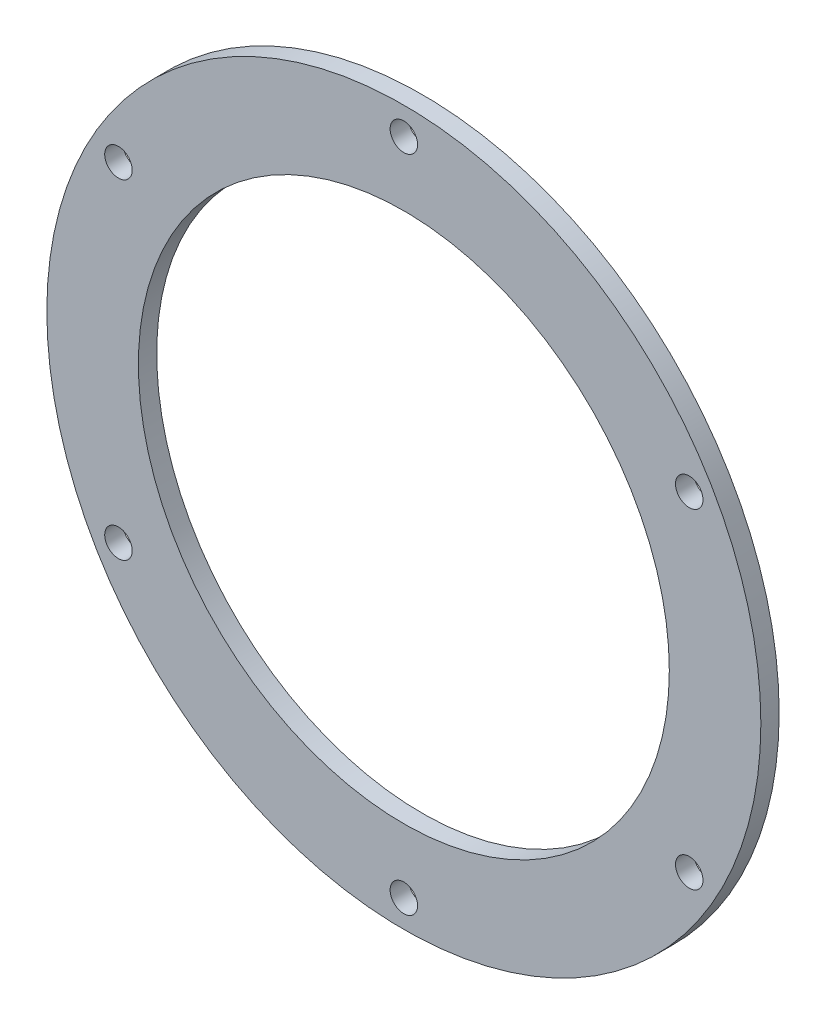
ISO-10303-21;
HEADER;
FILE_DESCRIPTION(('STEP AP214'),'2;1');
FILE_NAME('part.step','',(''),(''),'','','');
FILE_SCHEMA(('AUTOMOTIVE_DESIGN { 1 0 10303 214 1 1 1 1 }'));
ENDSEC;
DATA;
#1=APPLICATION_CONTEXT('core data for automotive mechanical design processes');
#2=APPLICATION_PROTOCOL_DEFINITION('international standard','automotive_design',2000,#1);
#3=PRODUCT_CONTEXT('',#1,'mechanical');
#4=PRODUCT('Part','Part','',(#3));
#5=PRODUCT_RELATED_PRODUCT_CATEGORY('part','',(#4));
#6=PRODUCT_DEFINITION_FORMATION('','',#4);
#7=PRODUCT_DEFINITION_CONTEXT('part definition',#1,'design');
#8=PRODUCT_DEFINITION('design','',#6,#7);
#9=PRODUCT_DEFINITION_SHAPE('','',#8);
#10=(LENGTH_UNIT() NAMED_UNIT(*) SI_UNIT(.MILLI.,.METRE.));
#11=(NAMED_UNIT(*) PLANE_ANGLE_UNIT() SI_UNIT($,.RADIAN.));
#12=(NAMED_UNIT(*) SI_UNIT($,.STERADIAN.) SOLID_ANGLE_UNIT());
#13=UNCERTAINTY_MEASURE_WITH_UNIT(LENGTH_MEASURE(1.E-05),#10,'distance_accuracy_value','');
#14=(GEOMETRIC_REPRESENTATION_CONTEXT(3) GLOBAL_UNCERTAINTY_ASSIGNED_CONTEXT((#13)) GLOBAL_UNIT_ASSIGNED_CONTEXT((#10,
#11,#12)) REPRESENTATION_CONTEXT('',''));
#15=CARTESIAN_POINT('',(0.,0.,0.));
#16=DIRECTION('',(0.,0.,1.));
#17=DIRECTION('',(1.,0.,0.));
#18=AXIS2_PLACEMENT_3D('',#15,#16,#17);
#19=CARTESIAN_POINT('',(0.,0.,2.));
#20=DIRECTION('',(0.,0.,-1.));
#21=DIRECTION('',(-1.,0.,0.));
#22=AXIS2_PLACEMENT_3D('',#19,#20,#21);
#23=CYLINDRICAL_SURFACE('',#22,29.);
#24=CARTESIAN_POINT('',(0.,0.,2.));
#25=DIRECTION('',(0.,0.,1.));
#26=DIRECTION('',(1.,0.,0.));
#27=AXIS2_PLACEMENT_3D('',#24,#25,#26);
#28=CIRCLE('',#27,29.);
#29=CARTESIAN_POINT('',(29.,0.,2.));
#30=VERTEX_POINT('',#29);
#31=EDGE_CURVE('E47',#30,#30,#28,.T.);
#32=ORIENTED_EDGE('',*,*,#31,.T.);
#33=EDGE_LOOP('',(#32));
#34=FACE_BOUND('',#33,.T.);
#35=CARTESIAN_POINT('',(0.,0.,0.));
#36=DIRECTION('',(0.,0.,1.));
#37=DIRECTION('',(1.,0.,0.));
#38=AXIS2_PLACEMENT_3D('',#35,#36,#37);
#39=CIRCLE('',#38,29.);
#40=CARTESIAN_POINT('',(29.,0.,0.));
#41=VERTEX_POINT('',#40);
#42=EDGE_CURVE('E73',#41,#41,#39,.T.);
#43=ORIENTED_EDGE('',*,*,#42,.F.);
#44=EDGE_LOOP('',(#43));
#45=FACE_BOUND('',#44,.T.);
#46=ADVANCED_FACE('F39',(#34,#45),#23,.F.);
#47=CARTESIAN_POINT('',(0.,36.,2.));
#48=DIRECTION('',(0.,0.,-1.));
#49=DIRECTION('',(-1.,0.,0.));
#50=AXIS2_PLACEMENT_3D('',#47,#48,#49);
#51=CYLINDRICAL_SURFACE('',#50,1.5);
#52=CARTESIAN_POINT('',(0.,36.,2.));
#53=DIRECTION('',(0.,0.,1.));
#54=DIRECTION('',(1.,0.,0.));
#55=AXIS2_PLACEMENT_3D('',#52,#53,#54);
#56=CIRCLE('',#55,1.5);
#57=CARTESIAN_POINT('',(1.5,36.,2.));
#58=VERTEX_POINT('',#57);
#59=EDGE_CURVE('E52',#58,#58,#56,.T.);
#60=ORIENTED_EDGE('',*,*,#59,.T.);
#61=EDGE_LOOP('',(#60));
#62=FACE_BOUND('',#61,.T.);
#63=CARTESIAN_POINT('',(0.,36.,0.));
#64=DIRECTION('',(0.,0.,1.));
#65=DIRECTION('',(1.,0.,0.));
#66=AXIS2_PLACEMENT_3D('',#63,#64,#65);
#67=CIRCLE('',#66,1.5);
#68=CARTESIAN_POINT('',(1.5,36.,0.));
#69=VERTEX_POINT('',#68);
#70=EDGE_CURVE('E71',#69,#69,#67,.T.);
#71=ORIENTED_EDGE('',*,*,#70,.F.);
#72=EDGE_LOOP('',(#71));
#73=FACE_BOUND('',#72,.T.);
#74=ADVANCED_FACE('F100',(#62,#73),#51,.F.);
#75=CARTESIAN_POINT('',(31.1769145362398,17.9999999999999,2.));
#76=DIRECTION('',(0.,0.,-1.));
#77=DIRECTION('',(-1.,0.,0.));
#78=AXIS2_PLACEMENT_3D('',#75,#76,#77);
#79=CYLINDRICAL_SURFACE('',#78,1.5);
#80=CARTESIAN_POINT('',(31.1769145362398,17.9999999999999,2.));
#81=DIRECTION('',(0.,0.,1.));
#82=DIRECTION('',(1.,0.,0.));
#83=AXIS2_PLACEMENT_3D('',#80,#81,#82);
#84=CIRCLE('',#83,1.5);
#85=CARTESIAN_POINT('',(32.6769145362398,17.9999999999999,2.));
#86=VERTEX_POINT('',#85);
#87=EDGE_CURVE('E95',#86,#86,#84,.T.);
#88=ORIENTED_EDGE('',*,*,#87,.T.);
#89=EDGE_LOOP('',(#88));
#90=FACE_BOUND('',#89,.T.);
#91=CARTESIAN_POINT('',(31.1769145362398,17.9999999999999,0.));
#92=DIRECTION('',(0.,0.,1.));
#93=DIRECTION('',(1.,0.,0.));
#94=AXIS2_PLACEMENT_3D('',#91,#92,#93);
#95=CIRCLE('',#94,1.5);
#96=CARTESIAN_POINT('',(32.6769145362398,17.9999999999999,0.));
#97=VERTEX_POINT('',#96);
#98=EDGE_CURVE('E68',#97,#97,#95,.T.);
#99=ORIENTED_EDGE('',*,*,#98,.F.);
#100=EDGE_LOOP('',(#99));
#101=FACE_BOUND('',#100,.T.);
#102=ADVANCED_FACE('F118',(#90,#101),#79,.F.);
#103=CARTESIAN_POINT('',(31.1769145362397,-18.0000000000001,2.));
#104=DIRECTION('',(0.,0.,-1.));
#105=DIRECTION('',(-1.,0.,0.));
#106=AXIS2_PLACEMENT_3D('',#103,#104,#105);
#107=CYLINDRICAL_SURFACE('',#106,1.5);
#108=CARTESIAN_POINT('',(31.1769145362397,-18.0000000000001,2.));
#109=DIRECTION('',(0.,0.,1.));
#110=DIRECTION('',(1.,0.,0.));
#111=AXIS2_PLACEMENT_3D('',#108,#109,#110);
#112=CIRCLE('',#111,1.5);
#113=CARTESIAN_POINT('',(32.6769145362397,-18.0000000000001,2.));
#114=VERTEX_POINT('',#113);
#115=EDGE_CURVE('E92',#114,#114,#112,.T.);
#116=ORIENTED_EDGE('',*,*,#115,.T.);
#117=EDGE_LOOP('',(#116));
#118=FACE_BOUND('',#117,.T.);
#119=CARTESIAN_POINT('',(31.1769145362397,-18.0000000000001,0.));
#120=DIRECTION('',(0.,0.,1.));
#121=DIRECTION('',(1.,0.,0.));
#122=AXIS2_PLACEMENT_3D('',#119,#120,#121);
#123=CIRCLE('',#122,1.5);
#124=CARTESIAN_POINT('',(32.6769145362397,-18.0000000000001,0.));
#125=VERTEX_POINT('',#124);
#126=EDGE_CURVE('E65',#125,#125,#123,.T.);
#127=ORIENTED_EDGE('',*,*,#126,.F.);
#128=EDGE_LOOP('',(#127));
#129=FACE_BOUND('',#128,.T.);
#130=ADVANCED_FACE('F125',(#118,#129),#107,.F.);
#131=CARTESIAN_POINT('',(-2.51386656396706E-13,-36.,2.));
#132=DIRECTION('',(0.,0.,-1.));
#133=DIRECTION('',(-1.,0.,0.));
#134=AXIS2_PLACEMENT_3D('',#131,#132,#133);
#135=CYLINDRICAL_SURFACE('',#134,1.5);
#136=CARTESIAN_POINT('',(-2.51386656396706E-13,-36.,2.));
#137=DIRECTION('',(0.,0.,1.));
#138=DIRECTION('',(1.,0.,0.));
#139=AXIS2_PLACEMENT_3D('',#136,#137,#138);
#140=CIRCLE('',#139,1.5);
#141=CARTESIAN_POINT('',(1.49999999999975,-36.,2.));
#142=VERTEX_POINT('',#141);
#143=EDGE_CURVE('E87',#142,#142,#140,.T.);
#144=ORIENTED_EDGE('',*,*,#143,.T.);
#145=EDGE_LOOP('',(#144));
#146=FACE_BOUND('',#145,.T.);
#147=CARTESIAN_POINT('',(-2.51386656396706E-13,-36.,0.));
#148=DIRECTION('',(0.,0.,1.));
#149=DIRECTION('',(1.,0.,0.));
#150=AXIS2_PLACEMENT_3D('',#147,#148,#149);
#151=CIRCLE('',#150,1.5);
#152=CARTESIAN_POINT('',(1.49999999999975,-36.,0.));
#153=VERTEX_POINT('',#152);
#154=EDGE_CURVE('E62',#153,#153,#151,.T.);
#155=ORIENTED_EDGE('',*,*,#154,.F.);
#156=EDGE_LOOP('',(#155));
#157=FACE_BOUND('',#156,.T.);
#158=ADVANCED_FACE('F129',(#146,#157),#135,.F.);
#159=CARTESIAN_POINT('',(-31.17691453624,-17.9999999999997,2.));
#160=DIRECTION('',(0.,0.,-1.));
#161=DIRECTION('',(-1.,0.,0.));
#162=AXIS2_PLACEMENT_3D('',#159,#160,#161);
#163=CYLINDRICAL_SURFACE('',#162,1.5);
#164=CARTESIAN_POINT('',(-31.17691453624,-17.9999999999997,2.));
#165=DIRECTION('',(0.,0.,1.));
#166=DIRECTION('',(1.,0.,0.));
#167=AXIS2_PLACEMENT_3D('',#164,#165,#166);
#168=CIRCLE('',#167,1.5);
#169=CARTESIAN_POINT('',(-29.67691453624,-17.9999999999997,2.));
#170=VERTEX_POINT('',#169);
#171=EDGE_CURVE('E82',#170,#170,#168,.T.);
#172=ORIENTED_EDGE('',*,*,#171,.T.);
#173=EDGE_LOOP('',(#172));
#174=FACE_BOUND('',#173,.T.);
#175=CARTESIAN_POINT('',(-31.17691453624,-17.9999999999997,0.));
#176=DIRECTION('',(0.,0.,1.));
#177=DIRECTION('',(1.,0.,0.));
#178=AXIS2_PLACEMENT_3D('',#175,#176,#177);
#179=CIRCLE('',#178,1.5);
#180=CARTESIAN_POINT('',(-29.67691453624,-17.9999999999997,0.));
#181=VERTEX_POINT('',#180);
#182=EDGE_CURVE('E59',#181,#181,#179,.T.);
#183=ORIENTED_EDGE('',*,*,#182,.F.);
#184=EDGE_LOOP('',(#183));
#185=FACE_BOUND('',#184,.T.);
#186=ADVANCED_FACE('F132',(#174,#185),#163,.F.);
#187=CARTESIAN_POINT('',(-31.1769145362396,18.0000000000004,2.));
#188=DIRECTION('',(0.,0.,-1.));
#189=DIRECTION('',(-1.,0.,0.));
#190=AXIS2_PLACEMENT_3D('',#187,#188,#189);
#191=CYLINDRICAL_SURFACE('',#190,1.5);
#192=CARTESIAN_POINT('',(-31.1769145362396,18.0000000000004,2.));
#193=DIRECTION('',(0.,0.,1.));
#194=DIRECTION('',(1.,0.,0.));
#195=AXIS2_PLACEMENT_3D('',#192,#193,#194);
#196=CIRCLE('',#195,1.5);
#197=CARTESIAN_POINT('',(-29.6769145362396,18.0000000000004,2.));
#198=VERTEX_POINT('',#197);
#199=EDGE_CURVE('E78',#198,#198,#196,.T.);
#200=ORIENTED_EDGE('',*,*,#199,.T.);
#201=EDGE_LOOP('',(#200));
#202=FACE_BOUND('',#201,.T.);
#203=CARTESIAN_POINT('',(-31.1769145362396,18.0000000000004,0.));
#204=DIRECTION('',(0.,0.,1.));
#205=DIRECTION('',(1.,0.,0.));
#206=AXIS2_PLACEMENT_3D('',#203,#204,#205);
#207=CIRCLE('',#206,1.5);
#208=CARTESIAN_POINT('',(-29.6769145362396,18.0000000000004,0.));
#209=VERTEX_POINT('',#208);
#210=EDGE_CURVE('E56',#209,#209,#207,.T.);
#211=ORIENTED_EDGE('',*,*,#210,.F.);
#212=EDGE_LOOP('',(#211));
#213=FACE_BOUND('',#212,.T.);
#214=ADVANCED_FACE('F41',(#202,#213),#191,.F.);
#215=CARTESIAN_POINT('',(0.,0.,2.));
#216=DIRECTION('',(0.,0.,-1.));
#217=DIRECTION('',(-1.,0.,0.));
#218=AXIS2_PLACEMENT_3D('',#215,#216,#217);
#219=CYLINDRICAL_SURFACE('',#218,39.);
#220=CARTESIAN_POINT('',(0.,0.,2.));
#221=DIRECTION('',(0.,0.,1.));
#222=DIRECTION('',(1.,0.,0.));
#223=AXIS2_PLACEMENT_3D('',#220,#221,#222);
#224=CIRCLE('',#223,39.);
#225=CARTESIAN_POINT('',(39.,0.,2.));
#226=VERTEX_POINT('',#225);
#227=EDGE_CURVE('E10',#226,#226,#224,.T.);
#228=ORIENTED_EDGE('',*,*,#227,.F.);
#229=EDGE_LOOP('',(#228));
#230=FACE_BOUND('',#229,.T.);
#231=CARTESIAN_POINT('',(0.,0.,0.));
#232=DIRECTION('',(0.,0.,1.));
#233=DIRECTION('',(1.,0.,0.));
#234=AXIS2_PLACEMENT_3D('',#231,#232,#233);
#235=CIRCLE('',#234,39.);
#236=CARTESIAN_POINT('',(39.,0.,0.));
#237=VERTEX_POINT('',#236);
#238=EDGE_CURVE('E43',#237,#237,#235,.T.);
#239=ORIENTED_EDGE('',*,*,#238,.T.);
#240=EDGE_LOOP('',(#239));
#241=FACE_BOUND('',#240,.T.);
#242=ADVANCED_FACE('F107',(#230,#241),#219,.T.);
#243=CARTESIAN_POINT('',(0.,0.,2.));
#244=DIRECTION('',(0.,0.,1.));
#245=DIRECTION('',(1.,0.,0.));
#246=AXIS2_PLACEMENT_3D('',#243,#244,#245);
#247=PLANE('',#246);
#248=ORIENTED_EDGE('',*,*,#199,.F.);
#249=EDGE_LOOP('',(#248));
#250=FACE_BOUND('',#249,.T.);
#251=ORIENTED_EDGE('',*,*,#171,.F.);
#252=EDGE_LOOP('',(#251));
#253=FACE_BOUND('',#252,.T.);
#254=ORIENTED_EDGE('',*,*,#143,.F.);
#255=EDGE_LOOP('',(#254));
#256=FACE_BOUND('',#255,.T.);
#257=ORIENTED_EDGE('',*,*,#115,.F.);
#258=EDGE_LOOP('',(#257));
#259=FACE_BOUND('',#258,.T.);
#260=ORIENTED_EDGE('',*,*,#87,.F.);
#261=EDGE_LOOP('',(#260));
#262=FACE_BOUND('',#261,.T.);
#263=ORIENTED_EDGE('',*,*,#59,.F.);
#264=EDGE_LOOP('',(#263));
#265=FACE_BOUND('',#264,.T.);
#266=ORIENTED_EDGE('',*,*,#31,.F.);
#267=EDGE_LOOP('',(#266));
#268=FACE_BOUND('',#267,.T.);
#269=ORIENTED_EDGE('',*,*,#227,.T.);
#270=EDGE_LOOP('',(#269));
#271=FACE_BOUND('',#270,.T.);
#272=ADVANCED_FACE('F103',(#250,#253,#256,#259,#262,#265,#268,#271),#247,.T.);
#273=CARTESIAN_POINT('',(0.,0.,0.));
#274=DIRECTION('',(0.,0.,1.));
#275=DIRECTION('',(1.,0.,0.));
#276=AXIS2_PLACEMENT_3D('',#273,#274,#275);
#277=PLANE('',#276);
#278=ORIENTED_EDGE('',*,*,#210,.T.);
#279=EDGE_LOOP('',(#278));
#280=FACE_BOUND('',#279,.T.);
#281=ORIENTED_EDGE('',*,*,#182,.T.);
#282=EDGE_LOOP('',(#281));
#283=FACE_BOUND('',#282,.T.);
#284=ORIENTED_EDGE('',*,*,#154,.T.);
#285=EDGE_LOOP('',(#284));
#286=FACE_BOUND('',#285,.T.);
#287=ORIENTED_EDGE('',*,*,#126,.T.);
#288=EDGE_LOOP('',(#287));
#289=FACE_BOUND('',#288,.T.);
#290=ORIENTED_EDGE('',*,*,#98,.T.);
#291=EDGE_LOOP('',(#290));
#292=FACE_BOUND('',#291,.T.);
#293=ORIENTED_EDGE('',*,*,#70,.T.);
#294=EDGE_LOOP('',(#293));
#295=FACE_BOUND('',#294,.T.);
#296=ORIENTED_EDGE('',*,*,#42,.T.);
#297=EDGE_LOOP('',(#296));
#298=FACE_BOUND('',#297,.T.);
#299=ORIENTED_EDGE('',*,*,#238,.F.);
#300=EDGE_LOOP('',(#299));
#301=FACE_BOUND('',#300,.T.);
#302=ADVANCED_FACE('F106',(#280,#283,#286,#289,#292,#295,#298,#301),#277,.F.);
#303=CLOSED_SHELL('',(#46,#74,#102,#130,#158,#186,#214,#242,#272,#302));
#304=MANIFOLD_SOLID_BREP('B2',#303);
#305=ADVANCED_BREP_SHAPE_REPRESENTATION('',(#18,#304),#14);
#306=SHAPE_DEFINITION_REPRESENTATION(#9,#305);
ENDSEC;
END-ISO-10303-21;
